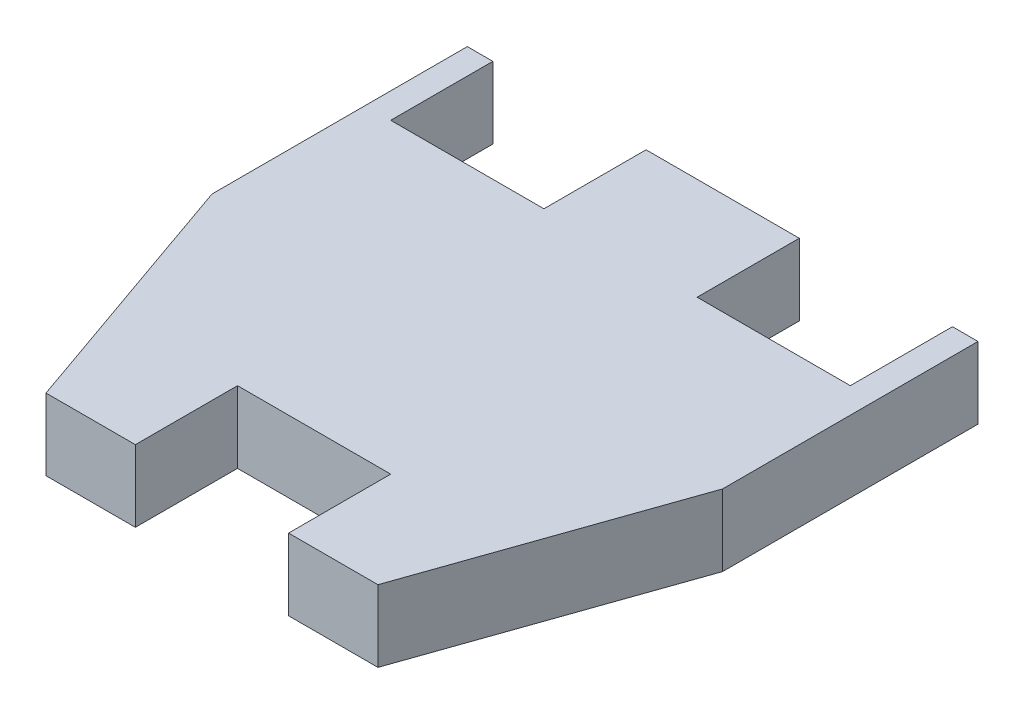
ISO-10303-21;
HEADER;
FILE_DESCRIPTION(('STEP AP214'),'2;1');
FILE_NAME('part.step','',(''),(''),'','','');
FILE_SCHEMA(('AUTOMOTIVE_DESIGN { 1 0 10303 214 1 1 1 1 }'));
ENDSEC;
DATA;
#1=APPLICATION_CONTEXT('core data for automotive mechanical design processes');
#2=APPLICATION_PROTOCOL_DEFINITION('international standard','automotive_design',2000,#1);
#3=PRODUCT_CONTEXT('',#1,'mechanical');
#4=PRODUCT('Part','Part','',(#3));
#5=PRODUCT_RELATED_PRODUCT_CATEGORY('part','',(#4));
#6=PRODUCT_DEFINITION_FORMATION('','',#4);
#7=PRODUCT_DEFINITION_CONTEXT('part definition',#1,'design');
#8=PRODUCT_DEFINITION('design','',#6,#7);
#9=PRODUCT_DEFINITION_SHAPE('','',#8);
#10=(LENGTH_UNIT() NAMED_UNIT(*) SI_UNIT(.MILLI.,.METRE.));
#11=(NAMED_UNIT(*) PLANE_ANGLE_UNIT() SI_UNIT($,.RADIAN.));
#12=(NAMED_UNIT(*) SI_UNIT($,.STERADIAN.) SOLID_ANGLE_UNIT());
#13=UNCERTAINTY_MEASURE_WITH_UNIT(LENGTH_MEASURE(1.E-05),#10,'distance_accuracy_value','');
#14=(GEOMETRIC_REPRESENTATION_CONTEXT(3) GLOBAL_UNCERTAINTY_ASSIGNED_CONTEXT((#13)) GLOBAL_UNIT_ASSIGNED_CONTEXT((#10,
#11,#12)) REPRESENTATION_CONTEXT('',''));
#15=CARTESIAN_POINT('',(0.,0.,0.));
#16=DIRECTION('',(0.,0.,1.));
#17=DIRECTION('',(1.,0.,0.));
#18=AXIS2_PLACEMENT_3D('',#15,#16,#17);
#19=CARTESIAN_POINT('',(0.,14.0277716506636,0.));
#20=DIRECTION('',(0.,1.,0.));
#21=DIRECTION('',(0.,0.,1.));
#22=AXIS2_PLACEMENT_3D('',#19,#20,#21);
#23=PLANE('',#22);
#24=DIRECTION('',(1.,0.,0.));
#25=VECTOR('',#24,1.);
#26=CARTESIAN_POINT('',(0.,14.0277716506636,50.));
#27=LINE('',#26,#25);
#28=CARTESIAN_POINT('',(15.,14.0277716506636,50.));
#29=VERTEX_POINT('',#28);
#30=CARTESIAN_POINT('',(32.5,14.0277716506636,50.));
#31=VERTEX_POINT('',#30);
#32=EDGE_CURVE('E255',#29,#31,#27,.T.);
#33=ORIENTED_EDGE('',*,*,#32,.T.);
#34=DIRECTION('',(0.330350424728106,0.,-0.943858356366017));
#35=VECTOR('',#34,1.);
#36=CARTESIAN_POINT('',(44.543429844098,14.0277716506636,15.5902004454343));
#37=LINE('',#36,#35);
#38=CARTESIAN_POINT('',(50.,14.0277716506636,0.));
#39=VERTEX_POINT('',#38);
#40=EDGE_CURVE('E160',#31,#39,#37,.T.);
#41=ORIENTED_EDGE('',*,*,#40,.T.);
#42=DIRECTION('',(0.,0.,1.));
#43=VECTOR('',#42,1.);
#44=CARTESIAN_POINT('',(50.,14.0277716506636,0.));
#45=LINE('',#44,#43);
#46=CARTESIAN_POINT('',(50.,14.0277716506636,-50.));
#47=VERTEX_POINT('',#46);
#48=EDGE_CURVE('E257',#47,#39,#45,.T.);
#49=ORIENTED_EDGE('',*,*,#48,.F.);
#50=DIRECTION('',(1.,0.,0.));
#51=VECTOR('',#50,1.);
#52=CARTESIAN_POINT('',(0.,14.0277716506636,-50.));
#53=LINE('',#52,#51);
#54=CARTESIAN_POINT('',(45.,14.0277716506636,-50.));
#55=VERTEX_POINT('',#54);
#56=EDGE_CURVE('E261',#55,#47,#53,.T.);
#57=ORIENTED_EDGE('',*,*,#56,.F.);
#58=DIRECTION('',(0.,0.,1.));
#59=VECTOR('',#58,1.);
#60=CARTESIAN_POINT('',(45.,14.0277716506636,0.));
#61=LINE('',#60,#59);
#62=CARTESIAN_POINT('',(45.,14.0277716506636,-30.));
#63=VERTEX_POINT('',#62);
#64=EDGE_CURVE('E264',#55,#63,#61,.T.);
#65=ORIENTED_EDGE('',*,*,#64,.T.);
#66=DIRECTION('',(1.,0.,0.));
#67=VECTOR('',#66,1.);
#68=CARTESIAN_POINT('',(0.,14.0277716506636,-30.));
#69=LINE('',#68,#67);
#70=CARTESIAN_POINT('',(15.,14.0277716506636,-30.));
#71=VERTEX_POINT('',#70);
#72=EDGE_CURVE('E268',#71,#63,#69,.T.);
#73=ORIENTED_EDGE('',*,*,#72,.F.);
#74=DIRECTION('',(0.,0.,1.));
#75=VECTOR('',#74,1.);
#76=CARTESIAN_POINT('',(15.,14.0277716506636,0.));
#77=LINE('',#76,#75);
#78=CARTESIAN_POINT('',(15.,14.0277716506636,-50.));
#79=VERTEX_POINT('',#78);
#80=EDGE_CURVE('E271',#79,#71,#77,.T.);
#81=ORIENTED_EDGE('',*,*,#80,.F.);
#82=CARTESIAN_POINT('',(-15.,14.0277716506636,-50.));
#83=VERTEX_POINT('',#82);
#84=EDGE_CURVE('E266',#83,#79,#53,.T.);
#85=ORIENTED_EDGE('',*,*,#84,.F.);
#86=DIRECTION('',(0.,0.,1.));
#87=VECTOR('',#86,1.);
#88=CARTESIAN_POINT('',(-15.,14.0277716506636,0.));
#89=LINE('',#88,#87);
#90=CARTESIAN_POINT('',(-15.,14.0277716506636,-30.));
#91=VERTEX_POINT('',#90);
#92=EDGE_CURVE('E274',#83,#91,#89,.T.);
#93=ORIENTED_EDGE('',*,*,#92,.T.);
#94=DIRECTION('',(1.,0.,0.));
#95=VECTOR('',#94,1.);
#96=CARTESIAN_POINT('',(0.,14.0277716506636,-30.));
#97=LINE('',#96,#95);
#98=CARTESIAN_POINT('',(-45.,14.0277716506636,-30.));
#99=VERTEX_POINT('',#98);
#100=EDGE_CURVE('E276',#99,#91,#97,.T.);
#101=ORIENTED_EDGE('',*,*,#100,.F.);
#102=DIRECTION('',(0.,0.,1.));
#103=VECTOR('',#102,1.);
#104=CARTESIAN_POINT('',(-45.,14.0277716506636,0.));
#105=LINE('',#104,#103);
#106=CARTESIAN_POINT('',(-45.,14.0277716506636,-50.));
#107=VERTEX_POINT('',#106);
#108=EDGE_CURVE('E279',#107,#99,#105,.T.);
#109=ORIENTED_EDGE('',*,*,#108,.F.);
#110=CARTESIAN_POINT('',(-50.,14.0277716506636,-50.));
#111=VERTEX_POINT('',#110);
#112=EDGE_CURVE('E265',#111,#107,#53,.T.);
#113=ORIENTED_EDGE('',*,*,#112,.F.);
#114=DIRECTION('',(0.,0.,1.));
#115=VECTOR('',#114,1.);
#116=CARTESIAN_POINT('',(-50.,14.0277716506636,0.));
#117=LINE('',#116,#115);
#118=CARTESIAN_POINT('',(-50.,14.0277716506636,0.));
#119=VERTEX_POINT('',#118);
#120=EDGE_CURVE('E282',#111,#119,#117,.T.);
#121=ORIENTED_EDGE('',*,*,#120,.T.);
#122=DIRECTION('',(0.330350424728106,0.,0.943858356366017));
#123=VECTOR('',#122,1.);
#124=CARTESIAN_POINT('',(-44.543429844098,14.0277716506636,15.5902004454343));
#125=LINE('',#124,#123);
#126=CARTESIAN_POINT('',(-32.5,14.0277716506636,50.));
#127=VERTEX_POINT('',#126);
#128=EDGE_CURVE('E237',#119,#127,#125,.T.);
#129=ORIENTED_EDGE('',*,*,#128,.T.);
#130=CARTESIAN_POINT('',(-15.,14.0277716506636,50.));
#131=VERTEX_POINT('',#130);
#132=EDGE_CURVE('E258',#127,#131,#27,.T.);
#133=ORIENTED_EDGE('',*,*,#132,.T.);
#134=DIRECTION('',(0.,0.,1.));
#135=VECTOR('',#134,1.);
#136=CARTESIAN_POINT('',(-15.,14.0277716506636,0.));
#137=LINE('',#136,#135);
#138=CARTESIAN_POINT('',(-15.,14.0277716506636,30.));
#139=VERTEX_POINT('',#138);
#140=EDGE_CURVE('E211',#139,#131,#137,.T.);
#141=ORIENTED_EDGE('',*,*,#140,.F.);
#142=DIRECTION('',(1.,0.,0.));
#143=VECTOR('',#142,1.);
#144=CARTESIAN_POINT('',(0.,14.0277716506636,30.));
#145=LINE('',#144,#143);
#146=CARTESIAN_POINT('',(15.,14.0277716506636,30.));
#147=VERTEX_POINT('',#146);
#148=EDGE_CURVE('E194',#139,#147,#145,.T.);
#149=ORIENTED_EDGE('',*,*,#148,.T.);
#150=DIRECTION('',(0.,0.,1.));
#151=VECTOR('',#150,1.);
#152=CARTESIAN_POINT('',(15.,14.0277716506636,0.));
#153=LINE('',#152,#151);
#154=EDGE_CURVE('E253',#147,#29,#153,.T.);
#155=ORIENTED_EDGE('',*,*,#154,.T.);
#156=EDGE_LOOP('',(#33,#41,#49,#57,#65,#73,#81,#85,#93,#101,#109,#113,#121,#129,#133,#141,#149,#155));
#157=FACE_BOUND('',#156,.T.);
#158=ADVANCED_FACE('F35',(#157),#23,.T.);
#159=CARTESIAN_POINT('',(0.,0.,0.));
#160=DIRECTION('',(0.,1.,0.));
#161=DIRECTION('',(0.,0.,1.));
#162=AXIS2_PLACEMENT_3D('',#159,#160,#161);
#163=PLANE('',#162);
#164=DIRECTION('',(-0.330350424728106,0.,0.943858356366017));
#165=VECTOR('',#164,1.);
#166=CARTESIAN_POINT('',(32.5,0.,50.));
#167=LINE('',#166,#165);
#168=CARTESIAN_POINT('',(50.,0.,0.));
#169=VERTEX_POINT('',#168);
#170=CARTESIAN_POINT('',(32.5,0.,50.));
#171=VERTEX_POINT('',#170);
#172=EDGE_CURVE('E50',#169,#171,#167,.T.);
#173=ORIENTED_EDGE('',*,*,#172,.T.);
#174=DIRECTION('',(1.,0.,0.));
#175=VECTOR('',#174,1.);
#176=CARTESIAN_POINT('',(0.,0.,50.));
#177=LINE('',#176,#175);
#178=CARTESIAN_POINT('',(15.,0.,50.));
#179=VERTEX_POINT('',#178);
#180=EDGE_CURVE('E170',#179,#171,#177,.T.);
#181=ORIENTED_EDGE('',*,*,#180,.F.);
#182=DIRECTION('',(0.,0.,1.));
#183=VECTOR('',#182,1.);
#184=CARTESIAN_POINT('',(15.,0.,0.));
#185=LINE('',#184,#183);
#186=CARTESIAN_POINT('',(15.,0.,30.));
#187=VERTEX_POINT('',#186);
#188=EDGE_CURVE('E179',#187,#179,#185,.T.);
#189=ORIENTED_EDGE('',*,*,#188,.F.);
#190=DIRECTION('',(1.,0.,0.));
#191=VECTOR('',#190,1.);
#192=CARTESIAN_POINT('',(0.,0.,30.));
#193=LINE('',#192,#191);
#194=CARTESIAN_POINT('',(-15.,0.,30.));
#195=VERTEX_POINT('',#194);
#196=EDGE_CURVE('E184',#195,#187,#193,.T.);
#197=ORIENTED_EDGE('',*,*,#196,.F.);
#198=DIRECTION('',(0.,0.,1.));
#199=VECTOR('',#198,1.);
#200=CARTESIAN_POINT('',(-15.,0.,0.));
#201=LINE('',#200,#199);
#202=CARTESIAN_POINT('',(-15.,0.,50.));
#203=VERTEX_POINT('',#202);
#204=EDGE_CURVE('E186',#195,#203,#201,.T.);
#205=ORIENTED_EDGE('',*,*,#204,.T.);
#206=CARTESIAN_POINT('',(-32.5,0.,50.));
#207=VERTEX_POINT('',#206);
#208=EDGE_CURVE('E181',#207,#203,#177,.T.);
#209=ORIENTED_EDGE('',*,*,#208,.F.);
#210=DIRECTION('',(-0.330350424728106,0.,-0.943858356366017));
#211=VECTOR('',#210,1.);
#212=CARTESIAN_POINT('',(-50.,0.,0.));
#213=LINE('',#212,#211);
#214=CARTESIAN_POINT('',(-50.,0.,0.));
#215=VERTEX_POINT('',#214);
#216=EDGE_CURVE('E385',#207,#215,#213,.T.);
#217=ORIENTED_EDGE('',*,*,#216,.T.);
#218=DIRECTION('',(0.,0.,1.));
#219=VECTOR('',#218,1.);
#220=CARTESIAN_POINT('',(-50.,0.,0.));
#221=LINE('',#220,#219);
#222=CARTESIAN_POINT('',(-50.,0.,-50.));
#223=VERTEX_POINT('',#222);
#224=EDGE_CURVE('E187',#223,#215,#221,.T.);
#225=ORIENTED_EDGE('',*,*,#224,.F.);
#226=DIRECTION('',(1.,0.,0.));
#227=VECTOR('',#226,1.);
#228=CARTESIAN_POINT('',(0.,0.,-50.));
#229=LINE('',#228,#227);
#230=CARTESIAN_POINT('',(-45.,0.,-50.));
#231=VERTEX_POINT('',#230);
#232=EDGE_CURVE('E197',#223,#231,#229,.T.);
#233=ORIENTED_EDGE('',*,*,#232,.T.);
#234=DIRECTION('',(0.,0.,1.));
#235=VECTOR('',#234,1.);
#236=CARTESIAN_POINT('',(-45.,0.,0.));
#237=LINE('',#236,#235);
#238=CARTESIAN_POINT('',(-45.,0.,-30.));
#239=VERTEX_POINT('',#238);
#240=EDGE_CURVE('E202',#231,#239,#237,.T.);
#241=ORIENTED_EDGE('',*,*,#240,.T.);
#242=DIRECTION('',(1.,0.,0.));
#243=VECTOR('',#242,1.);
#244=CARTESIAN_POINT('',(0.,0.,-30.));
#245=LINE('',#244,#243);
#246=CARTESIAN_POINT('',(-15.,0.,-30.));
#247=VERTEX_POINT('',#246);
#248=EDGE_CURVE('E384',#239,#247,#245,.T.);
#249=ORIENTED_EDGE('',*,*,#248,.T.);
#250=DIRECTION('',(0.,0.,1.));
#251=VECTOR('',#250,1.);
#252=CARTESIAN_POINT('',(-15.,0.,0.));
#253=LINE('',#252,#251);
#254=CARTESIAN_POINT('',(-15.,0.,-50.));
#255=VERTEX_POINT('',#254);
#256=EDGE_CURVE('E515',#255,#247,#253,.T.);
#257=ORIENTED_EDGE('',*,*,#256,.F.);
#258=CARTESIAN_POINT('',(15.,0.,-50.));
#259=VERTEX_POINT('',#258);
#260=EDGE_CURVE('E204',#255,#259,#229,.T.);
#261=ORIENTED_EDGE('',*,*,#260,.T.);
#262=DIRECTION('',(0.,0.,1.));
#263=VECTOR('',#262,1.);
#264=CARTESIAN_POINT('',(15.,0.,0.));
#265=LINE('',#264,#263);
#266=CARTESIAN_POINT('',(15.,0.,-30.));
#267=VERTEX_POINT('',#266);
#268=EDGE_CURVE('E369',#259,#267,#265,.T.);
#269=ORIENTED_EDGE('',*,*,#268,.T.);
#270=DIRECTION('',(1.,0.,0.));
#271=VECTOR('',#270,1.);
#272=CARTESIAN_POINT('',(0.,0.,-30.));
#273=LINE('',#272,#271);
#274=CARTESIAN_POINT('',(45.,0.,-30.));
#275=VERTEX_POINT('',#274);
#276=EDGE_CURVE('E521',#267,#275,#273,.T.);
#277=ORIENTED_EDGE('',*,*,#276,.T.);
#278=DIRECTION('',(0.,0.,1.));
#279=VECTOR('',#278,1.);
#280=CARTESIAN_POINT('',(45.,0.,0.));
#281=LINE('',#280,#279);
#282=CARTESIAN_POINT('',(45.,0.,-50.));
#283=VERTEX_POINT('',#282);
#284=EDGE_CURVE('E524',#283,#275,#281,.T.);
#285=ORIENTED_EDGE('',*,*,#284,.F.);
#286=CARTESIAN_POINT('',(50.,0.,-50.));
#287=VERTEX_POINT('',#286);
#288=EDGE_CURVE('E182',#283,#287,#229,.T.);
#289=ORIENTED_EDGE('',*,*,#288,.T.);
#290=DIRECTION('',(0.,0.,1.));
#291=VECTOR('',#290,1.);
#292=CARTESIAN_POINT('',(50.,0.,0.));
#293=LINE('',#292,#291);
#294=EDGE_CURVE('E173',#287,#169,#293,.T.);
#295=ORIENTED_EDGE('',*,*,#294,.T.);
#296=EDGE_LOOP('',(#173,#181,#189,#197,#205,#209,#217,#225,#233,#241,#249,#257,#261,#269,#277,
#285,#289,#295));
#297=FACE_BOUND('',#296,.T.);
#298=ADVANCED_FACE('F169',(#297),#163,.F.);
#299=CARTESIAN_POINT('',(0.,14.0277716506636,50.));
#300=DIRECTION('',(0.,0.,-1.));
#301=DIRECTION('',(-1.,0.,0.));
#302=AXIS2_PLACEMENT_3D('',#299,#300,#301);
#303=PLANE('',#302);
#304=DIRECTION('',(0.,-1.,0.));
#305=VECTOR('',#304,1.);
#306=CARTESIAN_POINT('',(32.5,16.,50.));
#307=LINE('',#306,#305);
#308=EDGE_CURVE('E157',#31,#171,#307,.T.);
#309=ORIENTED_EDGE('',*,*,#308,.F.);
#310=ORIENTED_EDGE('',*,*,#32,.F.);
#311=DIRECTION('',(0.,-1.,0.));
#312=VECTOR('',#311,1.);
#313=CARTESIAN_POINT('',(15.,14.0277716506636,50.));
#314=LINE('',#313,#312);
#315=EDGE_CURVE('E178',#29,#179,#314,.T.);
#316=ORIENTED_EDGE('',*,*,#315,.T.);
#317=ORIENTED_EDGE('',*,*,#180,.T.);
#318=EDGE_LOOP('',(#309,#310,#316,#317));
#319=FACE_BOUND('',#318,.T.);
#320=ADVANCED_FACE('F176',(#319),#303,.F.);
#321=CARTESIAN_POINT('',(50.,14.0277716506636,0.));
#322=DIRECTION('',(1.,0.,0.));
#323=DIRECTION('',(0.,0.,-1.));
#324=AXIS2_PLACEMENT_3D('',#321,#322,#323);
#325=PLANE('',#324);
#326=ORIENTED_EDGE('',*,*,#48,.T.);
#327=DIRECTION('',(0.,-1.,0.));
#328=VECTOR('',#327,1.);
#329=CARTESIAN_POINT('',(50.,14.0277716506636,0.));
#330=LINE('',#329,#328);
#331=EDGE_CURVE('E11',#39,#169,#330,.T.);
#332=ORIENTED_EDGE('',*,*,#331,.T.);
#333=ORIENTED_EDGE('',*,*,#294,.F.);
#334=DIRECTION('',(0.,-1.,0.));
#335=VECTOR('',#334,1.);
#336=CARTESIAN_POINT('',(50.,14.0277716506636,-50.));
#337=LINE('',#336,#335);
#338=EDGE_CURVE('E231',#47,#287,#337,.T.);
#339=ORIENTED_EDGE('',*,*,#338,.F.);
#340=EDGE_LOOP('',(#326,#332,#333,#339));
#341=FACE_BOUND('',#340,.T.);
#342=ADVANCED_FACE('F324',(#341),#325,.T.);
#343=CARTESIAN_POINT('',(-50.,14.0277716506636,0.));
#344=DIRECTION('',(1.,0.,0.));
#345=DIRECTION('',(0.,0.,-1.));
#346=AXIS2_PLACEMENT_3D('',#343,#344,#345);
#347=PLANE('',#346);
#348=DIRECTION('',(0.,-1.,0.));
#349=VECTOR('',#348,1.);
#350=CARTESIAN_POINT('',(-50.,16.,0.));
#351=LINE('',#350,#349);
#352=EDGE_CURVE('E57',#119,#215,#351,.T.);
#353=ORIENTED_EDGE('',*,*,#352,.F.);
#354=ORIENTED_EDGE('',*,*,#120,.F.);
#355=DIRECTION('',(0.,-1.,0.));
#356=VECTOR('',#355,1.);
#357=CARTESIAN_POINT('',(-50.,14.0277716506636,-50.));
#358=LINE('',#357,#356);
#359=EDGE_CURVE('E213',#111,#223,#358,.T.);
#360=ORIENTED_EDGE('',*,*,#359,.T.);
#361=ORIENTED_EDGE('',*,*,#224,.T.);
#362=EDGE_LOOP('',(#353,#354,#360,#361));
#363=FACE_BOUND('',#362,.T.);
#364=ADVANCED_FACE('F322',(#363),#347,.F.);
#365=DIRECTION('',(0.,-1.,0.));
#366=VECTOR('',#365,1.);
#367=CARTESIAN_POINT('',(-32.5,16.,50.));
#368=LINE('',#367,#366);
#369=EDGE_CURVE('E243',#127,#207,#368,.T.);
#370=ORIENTED_EDGE('',*,*,#369,.T.);
#371=ORIENTED_EDGE('',*,*,#208,.T.);
#372=DIRECTION('',(0.,-1.,0.));
#373=VECTOR('',#372,1.);
#374=CARTESIAN_POINT('',(-15.,14.0277716506636,50.));
#375=LINE('',#374,#373);
#376=EDGE_CURVE('E210',#131,#203,#375,.T.);
#377=ORIENTED_EDGE('',*,*,#376,.F.);
#378=ORIENTED_EDGE('',*,*,#132,.F.);
#379=EDGE_LOOP('',(#370,#371,#377,#378));
#380=FACE_BOUND('',#379,.T.);
#381=ADVANCED_FACE('F287',(#380),#303,.F.);
#382=CARTESIAN_POINT('',(0.,14.0277716506636,30.));
#383=DIRECTION('',(0.,0.,-1.));
#384=DIRECTION('',(-1.,0.,0.));
#385=AXIS2_PLACEMENT_3D('',#382,#383,#384);
#386=PLANE('',#385);
#387=ORIENTED_EDGE('',*,*,#196,.T.);
#388=DIRECTION('',(0.,-1.,0.));
#389=VECTOR('',#388,1.);
#390=CARTESIAN_POINT('',(15.,14.0277716506636,30.));
#391=LINE('',#390,#389);
#392=EDGE_CURVE('E43',#147,#187,#391,.T.);
#393=ORIENTED_EDGE('',*,*,#392,.F.);
#394=ORIENTED_EDGE('',*,*,#148,.F.);
#395=DIRECTION('',(0.,-1.,0.));
#396=VECTOR('',#395,1.);
#397=CARTESIAN_POINT('',(-15.,14.0277716506636,30.));
#398=LINE('',#397,#396);
#399=EDGE_CURVE('E208',#139,#195,#398,.T.);
#400=ORIENTED_EDGE('',*,*,#399,.T.);
#401=EDGE_LOOP('',(#387,#393,#394,#400));
#402=FACE_BOUND('',#401,.T.);
#403=ADVANCED_FACE('F37',(#402),#386,.F.);
#404=CARTESIAN_POINT('',(15.,14.0277716506636,0.));
#405=DIRECTION('',(1.,0.,0.));
#406=DIRECTION('',(0.,0.,-1.));
#407=AXIS2_PLACEMENT_3D('',#404,#405,#406);
#408=PLANE('',#407);
#409=CARTESIAN_POINT('',(15.,6.56507932870909,40.2052318652864));
#410=DIRECTION('',(1.,0.,0.));
#411=DIRECTION('',(0.,0.,-1.));
#412=AXIS2_PLACEMENT_3D('',#409,#410,#411);
#413=CIRCLE('',#412,5.);
#414=CARTESIAN_POINT('',(15.,6.56507932870909,35.2052318652864));
#415=VERTEX_POINT('',#414);
#416=EDGE_CURVE('E235',#415,#415,#413,.T.);
#417=ORIENTED_EDGE('',*,*,#416,.T.);
#418=EDGE_LOOP('',(#417));
#419=FACE_BOUND('',#418,.T.);
#420=ORIENTED_EDGE('',*,*,#188,.T.);
#421=ORIENTED_EDGE('',*,*,#315,.F.);
#422=ORIENTED_EDGE('',*,*,#154,.F.);
#423=ORIENTED_EDGE('',*,*,#392,.T.);
#424=EDGE_LOOP('',(#420,#421,#422,#423));
#425=FACE_BOUND('',#424,.T.);
#426=ADVANCED_FACE('F295',(#419,#425),#408,.F.);
#427=CARTESIAN_POINT('',(0.,14.0277716506636,-50.));
#428=DIRECTION('',(0.,0.,-1.));
#429=DIRECTION('',(-1.,0.,0.));
#430=AXIS2_PLACEMENT_3D('',#427,#428,#429);
#431=PLANE('',#430);
#432=ORIENTED_EDGE('',*,*,#288,.F.);
#433=DIRECTION('',(0.,-1.,0.));
#434=VECTOR('',#433,1.);
#435=CARTESIAN_POINT('',(45.,14.0277716506636,-50.));
#436=LINE('',#435,#434);
#437=EDGE_CURVE('E229',#55,#283,#436,.T.);
#438=ORIENTED_EDGE('',*,*,#437,.F.);
#439=ORIENTED_EDGE('',*,*,#56,.T.);
#440=ORIENTED_EDGE('',*,*,#338,.T.);
#441=EDGE_LOOP('',(#432,#438,#439,#440));
#442=FACE_BOUND('',#441,.T.);
#443=ADVANCED_FACE('F297',(#442),#431,.T.);
#444=CARTESIAN_POINT('',(45.,14.0277716506636,0.));
#445=DIRECTION('',(1.,0.,0.));
#446=DIRECTION('',(0.,0.,-1.));
#447=AXIS2_PLACEMENT_3D('',#444,#445,#446);
#448=PLANE('',#447);
#449=ORIENTED_EDGE('',*,*,#284,.T.);
#450=DIRECTION('',(0.,-1.,0.));
#451=VECTOR('',#450,1.);
#452=CARTESIAN_POINT('',(45.,14.0277716506636,-30.));
#453=LINE('',#452,#451);
#454=EDGE_CURVE('E227',#63,#275,#453,.T.);
#455=ORIENTED_EDGE('',*,*,#454,.F.);
#456=ORIENTED_EDGE('',*,*,#64,.F.);
#457=ORIENTED_EDGE('',*,*,#437,.T.);
#458=EDGE_LOOP('',(#449,#455,#456,#457));
#459=FACE_BOUND('',#458,.T.);
#460=ADVANCED_FACE('F302',(#459),#448,.F.);
#461=CARTESIAN_POINT('',(0.,14.0277716506636,-30.));
#462=DIRECTION('',(0.,0.,-1.));
#463=DIRECTION('',(-1.,0.,0.));
#464=AXIS2_PLACEMENT_3D('',#461,#462,#463);
#465=PLANE('',#464);
#466=ORIENTED_EDGE('',*,*,#276,.F.);
#467=DIRECTION('',(0.,-1.,0.));
#468=VECTOR('',#467,1.);
#469=CARTESIAN_POINT('',(15.,14.0277716506636,-30.));
#470=LINE('',#469,#468);
#471=EDGE_CURVE('E225',#71,#267,#470,.T.);
#472=ORIENTED_EDGE('',*,*,#471,.F.);
#473=ORIENTED_EDGE('',*,*,#72,.T.);
#474=ORIENTED_EDGE('',*,*,#454,.T.);
#475=EDGE_LOOP('',(#466,#472,#473,#474));
#476=FACE_BOUND('',#475,.T.);
#477=ADVANCED_FACE('F343',(#476),#465,.T.);
#478=CARTESIAN_POINT('',(15.,14.0277716506636,0.));
#479=DIRECTION('',(1.,0.,0.));
#480=DIRECTION('',(0.,0.,-1.));
#481=AXIS2_PLACEMENT_3D('',#478,#479,#480);
#482=PLANE('',#481);
#483=ORIENTED_EDGE('',*,*,#268,.F.);
#484=DIRECTION('',(0.,-1.,0.));
#485=VECTOR('',#484,1.);
#486=CARTESIAN_POINT('',(15.,14.0277716506636,-50.));
#487=LINE('',#486,#485);
#488=EDGE_CURVE('E223',#79,#259,#487,.T.);
#489=ORIENTED_EDGE('',*,*,#488,.F.);
#490=ORIENTED_EDGE('',*,*,#80,.T.);
#491=ORIENTED_EDGE('',*,*,#471,.T.);
#492=EDGE_LOOP('',(#483,#489,#490,#491));
#493=FACE_BOUND('',#492,.T.);
#494=ADVANCED_FACE('F340',(#493),#482,.T.);
#495=ORIENTED_EDGE('',*,*,#260,.F.);
#496=DIRECTION('',(0.,-1.,0.));
#497=VECTOR('',#496,1.);
#498=CARTESIAN_POINT('',(-15.,14.0277716506636,-50.));
#499=LINE('',#498,#497);
#500=EDGE_CURVE('E221',#83,#255,#499,.T.);
#501=ORIENTED_EDGE('',*,*,#500,.F.);
#502=ORIENTED_EDGE('',*,*,#84,.T.);
#503=ORIENTED_EDGE('',*,*,#488,.T.);
#504=EDGE_LOOP('',(#495,#501,#502,#503));
#505=FACE_BOUND('',#504,.T.);
#506=ADVANCED_FACE('F305',(#505),#431,.T.);
#507=CARTESIAN_POINT('',(-15.,14.0277716506636,0.));
#508=DIRECTION('',(1.,0.,0.));
#509=DIRECTION('',(0.,0.,-1.));
#510=AXIS2_PLACEMENT_3D('',#507,#508,#509);
#511=PLANE('',#510);
#512=ORIENTED_EDGE('',*,*,#256,.T.);
#513=DIRECTION('',(0.,-1.,0.));
#514=VECTOR('',#513,1.);
#515=CARTESIAN_POINT('',(-15.,14.0277716506636,-30.));
#516=LINE('',#515,#514);
#517=EDGE_CURVE('E219',#91,#247,#516,.T.);
#518=ORIENTED_EDGE('',*,*,#517,.F.);
#519=ORIENTED_EDGE('',*,*,#92,.F.);
#520=ORIENTED_EDGE('',*,*,#500,.T.);
#521=EDGE_LOOP('',(#512,#518,#519,#520));
#522=FACE_BOUND('',#521,.T.);
#523=ADVANCED_FACE('F335',(#522),#511,.F.);
#524=CARTESIAN_POINT('',(0.,14.0277716506636,-30.));
#525=DIRECTION('',(0.,0.,-1.));
#526=DIRECTION('',(-1.,0.,0.));
#527=AXIS2_PLACEMENT_3D('',#524,#525,#526);
#528=PLANE('',#527);
#529=ORIENTED_EDGE('',*,*,#248,.F.);
#530=DIRECTION('',(0.,-1.,0.));
#531=VECTOR('',#530,1.);
#532=CARTESIAN_POINT('',(-45.,14.0277716506636,-30.));
#533=LINE('',#532,#531);
#534=EDGE_CURVE('E217',#99,#239,#533,.T.);
#535=ORIENTED_EDGE('',*,*,#534,.F.);
#536=ORIENTED_EDGE('',*,*,#100,.T.);
#537=ORIENTED_EDGE('',*,*,#517,.T.);
#538=EDGE_LOOP('',(#529,#535,#536,#537));
#539=FACE_BOUND('',#538,.T.);
#540=ADVANCED_FACE('F331',(#539),#528,.T.);
#541=CARTESIAN_POINT('',(-45.,14.0277716506636,0.));
#542=DIRECTION('',(1.,0.,0.));
#543=DIRECTION('',(0.,0.,-1.));
#544=AXIS2_PLACEMENT_3D('',#541,#542,#543);
#545=PLANE('',#544);
#546=ORIENTED_EDGE('',*,*,#240,.F.);
#547=DIRECTION('',(0.,-1.,0.));
#548=VECTOR('',#547,1.);
#549=CARTESIAN_POINT('',(-45.,14.0277716506636,-50.));
#550=LINE('',#549,#548);
#551=EDGE_CURVE('E215',#107,#231,#550,.T.);
#552=ORIENTED_EDGE('',*,*,#551,.F.);
#553=ORIENTED_EDGE('',*,*,#108,.T.);
#554=ORIENTED_EDGE('',*,*,#534,.T.);
#555=EDGE_LOOP('',(#546,#552,#553,#554));
#556=FACE_BOUND('',#555,.T.);
#557=ADVANCED_FACE('F327',(#556),#545,.T.);
#558=ORIENTED_EDGE('',*,*,#232,.F.);
#559=ORIENTED_EDGE('',*,*,#359,.F.);
#560=ORIENTED_EDGE('',*,*,#112,.T.);
#561=ORIENTED_EDGE('',*,*,#551,.T.);
#562=EDGE_LOOP('',(#558,#559,#560,#561));
#563=FACE_BOUND('',#562,.T.);
#564=ADVANCED_FACE('F306',(#563),#431,.T.);
#565=CARTESIAN_POINT('',(-15.,14.0277716506636,0.));
#566=DIRECTION('',(1.,0.,0.));
#567=DIRECTION('',(0.,0.,-1.));
#568=AXIS2_PLACEMENT_3D('',#565,#566,#567);
#569=PLANE('',#568);
#570=ORIENTED_EDGE('',*,*,#204,.F.);
#571=ORIENTED_EDGE('',*,*,#399,.F.);
#572=ORIENTED_EDGE('',*,*,#140,.T.);
#573=ORIENTED_EDGE('',*,*,#376,.T.);
#574=EDGE_LOOP('',(#570,#571,#572,#573));
#575=FACE_BOUND('',#574,.T.);
#576=ADVANCED_FACE('F289',(#575),#569,.T.);
#577=CARTESIAN_POINT('',(15.,6.56507932870909,40.2052318652864));
#578=DIRECTION('',(0.,1.,0.));
#579=DIRECTION('',(0.,0.,1.));
#580=AXIS2_PLACEMENT_3D('',#577,#578,#579);
#581=SPHERICAL_SURFACE('',#580,5.);
#582=CARTESIAN_POINT('',(15.,6.56507932870909,40.2052318652864));
#583=DIRECTION('',(1.,0.,0.));
#584=DIRECTION('',(0.,0.,-1.));
#585=AXIS2_PLACEMENT_3D('',#582,#583,#584);
#586=SPHERICAL_SURFACE('',#585,5.);
#587=ORIENTED_EDGE('',*,*,#416,.F.);
#588=EDGE_LOOP('',(#587));
#589=FACE_BOUND('',#588,.T.);
#590=ADVANCED_FACE('F315',(#589),#586,.T.);
#591=CARTESIAN_POINT('',(-50.,16.,0.));
#592=DIRECTION('',(-0.943858356366017,0.,0.330350424728106));
#593=DIRECTION('',(0.330350424728106,0.,0.943858356366017));
#594=AXIS2_PLACEMENT_3D('',#591,#592,#593);
#595=PLANE('',#594);
#596=ORIENTED_EDGE('',*,*,#352,.T.);
#597=ORIENTED_EDGE('',*,*,#216,.F.);
#598=ORIENTED_EDGE('',*,*,#369,.F.);
#599=ORIENTED_EDGE('',*,*,#128,.F.);
#600=EDGE_LOOP('',(#596,#597,#598,#599));
#601=FACE_BOUND('',#600,.T.);
#602=ADVANCED_FACE('F388',(#601),#595,.T.);
#603=CARTESIAN_POINT('',(32.5,16.,50.));
#604=DIRECTION('',(0.943858356366017,0.,0.330350424728106));
#605=DIRECTION('',(0.330350424728106,0.,-0.943858356366017));
#606=AXIS2_PLACEMENT_3D('',#603,#604,#605);
#607=PLANE('',#606);
#608=ORIENTED_EDGE('',*,*,#308,.T.);
#609=ORIENTED_EDGE('',*,*,#172,.F.);
#610=ORIENTED_EDGE('',*,*,#331,.F.);
#611=ORIENTED_EDGE('',*,*,#40,.F.);
#612=EDGE_LOOP('',(#608,#609,#610,#611));
#613=FACE_BOUND('',#612,.T.);
#614=ADVANCED_FACE('F158',(#613),#607,.T.);
#615=CLOSED_SHELL('',(#158,#298,#320,#342,#364,#381,#403,#426,#443,#460,#477,#494,#506,#523,
#540,#557,#564,#576,#590,#602,#614));
#616=MANIFOLD_SOLID_BREP('B2',#615);
#617=ADVANCED_BREP_SHAPE_REPRESENTATION('',(#18,#616),#14);
#618=SHAPE_DEFINITION_REPRESENTATION(#9,#617);
ENDSEC;
END-ISO-10303-21;
